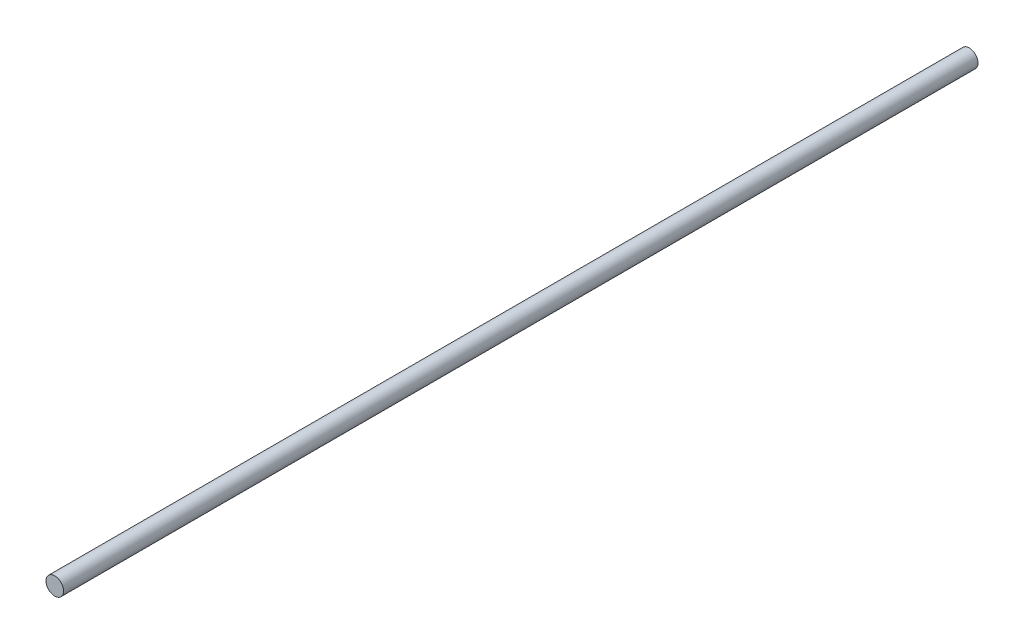
ISO-10303-21;
HEADER;
FILE_DESCRIPTION(('STEP AP214'),'2;1');
FILE_NAME('part.step','',(''),(''),'','','');
FILE_SCHEMA(('AUTOMOTIVE_DESIGN { 1 0 10303 214 1 1 1 1 }'));
ENDSEC;
DATA;
#1=APPLICATION_CONTEXT('core data for automotive mechanical design processes');
#2=APPLICATION_PROTOCOL_DEFINITION('international standard','automotive_design',2000,#1);
#3=PRODUCT_CONTEXT('',#1,'mechanical');
#4=PRODUCT('Part','Part','',(#3));
#5=PRODUCT_RELATED_PRODUCT_CATEGORY('part','',(#4));
#6=PRODUCT_DEFINITION_FORMATION('','',#4);
#7=PRODUCT_DEFINITION_CONTEXT('part definition',#1,'design');
#8=PRODUCT_DEFINITION('design','',#6,#7);
#9=PRODUCT_DEFINITION_SHAPE('','',#8);
#10=(LENGTH_UNIT() NAMED_UNIT(*) SI_UNIT(.MILLI.,.METRE.));
#11=(NAMED_UNIT(*) PLANE_ANGLE_UNIT() SI_UNIT($,.RADIAN.));
#12=(NAMED_UNIT(*) SI_UNIT($,.STERADIAN.) SOLID_ANGLE_UNIT());
#13=UNCERTAINTY_MEASURE_WITH_UNIT(LENGTH_MEASURE(1.E-05),#10,'distance_accuracy_value','');
#14=(GEOMETRIC_REPRESENTATION_CONTEXT(3) GLOBAL_UNCERTAINTY_ASSIGNED_CONTEXT((#13)) GLOBAL_UNIT_ASSIGNED_CONTEXT((#10,
#11,#12)) REPRESENTATION_CONTEXT('',''));
#15=CARTESIAN_POINT('',(0.,0.,0.));
#16=DIRECTION('',(0.,0.,1.));
#17=DIRECTION('',(1.,0.,0.));
#18=AXIS2_PLACEMENT_3D('',#15,#16,#17);
#19=CARTESIAN_POINT('',(0.,0.,288.925));
#20=DIRECTION('',(0.,0.,-1.));
#21=DIRECTION('',(-1.,0.,0.));
#22=AXIS2_PLACEMENT_3D('',#19,#20,#21);
#23=CYLINDRICAL_SURFACE('',#22,5.55625);
#24=CARTESIAN_POINT('',(0.,0.,288.925));
#25=DIRECTION('',(0.,0.,1.));
#26=DIRECTION('',(1.,0.,0.));
#27=AXIS2_PLACEMENT_3D('',#24,#25,#26);
#28=CIRCLE('',#27,5.55625);
#29=CARTESIAN_POINT('',(5.55625,0.,288.925));
#30=VERTEX_POINT('',#29);
#31=EDGE_CURVE('E10',#30,#30,#28,.T.);
#32=ORIENTED_EDGE('',*,*,#31,.F.);
#33=EDGE_LOOP('',(#32));
#34=FACE_BOUND('',#33,.T.);
#35=CARTESIAN_POINT('',(0.,0.,-288.925));
#36=DIRECTION('',(0.,0.,1.));
#37=DIRECTION('',(1.,0.,0.));
#38=AXIS2_PLACEMENT_3D('',#35,#36,#37);
#39=CIRCLE('',#38,5.55625);
#40=CARTESIAN_POINT('',(5.55625,0.,-288.925));
#41=VERTEX_POINT('',#40);
#42=EDGE_CURVE('E40',#41,#41,#39,.T.);
#43=ORIENTED_EDGE('',*,*,#42,.T.);
#44=EDGE_LOOP('',(#43));
#45=FACE_BOUND('',#44,.T.);
#46=ADVANCED_FACE('F37',(#34,#45),#23,.T.);
#47=CARTESIAN_POINT('',(0.,0.,288.925));
#48=DIRECTION('',(0.,0.,1.));
#49=DIRECTION('',(1.,0.,0.));
#50=AXIS2_PLACEMENT_3D('',#47,#48,#49);
#51=PLANE('',#50);
#52=ORIENTED_EDGE('',*,*,#31,.T.);
#53=EDGE_LOOP('',(#52));
#54=FACE_BOUND('',#53,.T.);
#55=ADVANCED_FACE('F52',(#54),#51,.T.);
#56=CARTESIAN_POINT('',(0.,0.,-288.925));
#57=DIRECTION('',(0.,0.,1.));
#58=DIRECTION('',(1.,0.,0.));
#59=AXIS2_PLACEMENT_3D('',#56,#57,#58);
#60=PLANE('',#59);
#61=ORIENTED_EDGE('',*,*,#42,.F.);
#62=EDGE_LOOP('',(#61));
#63=FACE_BOUND('',#62,.T.);
#64=ADVANCED_FACE('F50',(#63),#60,.F.);
#65=CLOSED_SHELL('',(#46,#55,#64));
#66=MANIFOLD_SOLID_BREP('B2',#65);
#67=ADVANCED_BREP_SHAPE_REPRESENTATION('',(#18,#66),#14);
#68=SHAPE_DEFINITION_REPRESENTATION(#9,#67);
ENDSEC;
END-ISO-10303-21;
